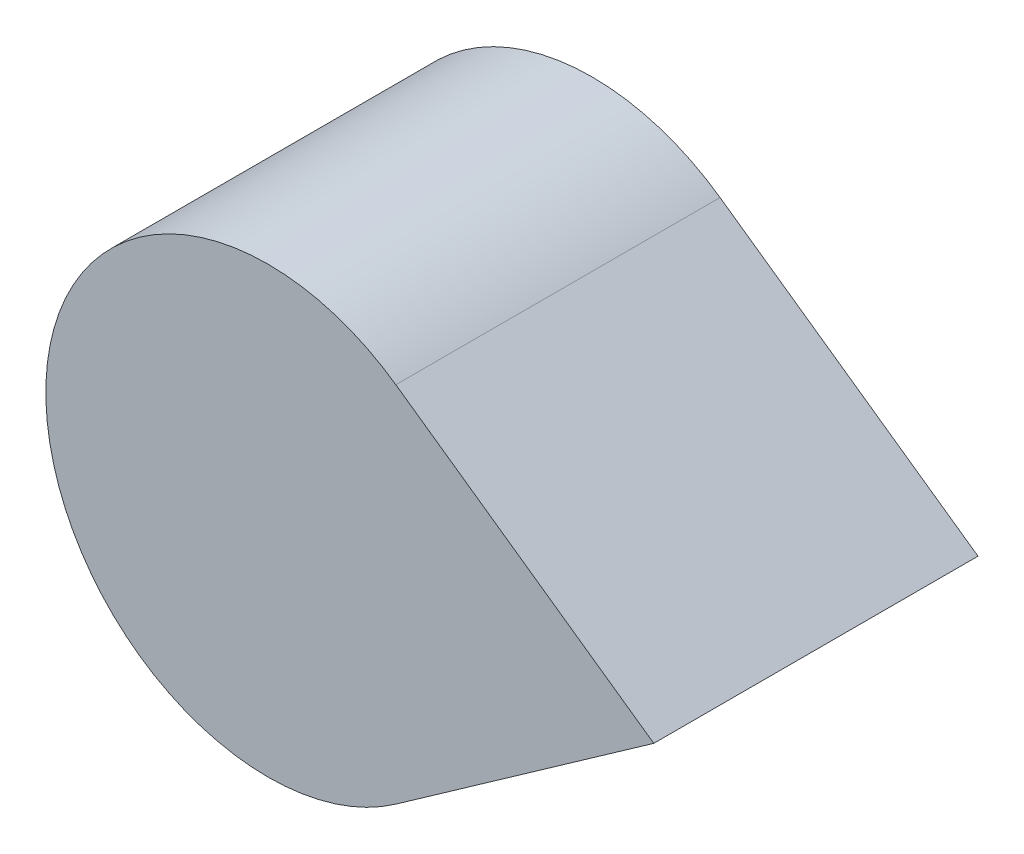
ISO-10303-21;
HEADER;
FILE_DESCRIPTION(('STEP AP214'),'2;1');
FILE_NAME('part.step','',(''),(''),'','','');
FILE_SCHEMA(('AUTOMOTIVE_DESIGN { 1 0 10303 214 1 1 1 1 }'));
ENDSEC;
DATA;
#1=APPLICATION_CONTEXT('core data for automotive mechanical design processes');
#2=APPLICATION_PROTOCOL_DEFINITION('international standard','automotive_design',2000,#1);
#3=PRODUCT_CONTEXT('',#1,'mechanical');
#4=PRODUCT('Part','Part','',(#3));
#5=PRODUCT_RELATED_PRODUCT_CATEGORY('part','',(#4));
#6=PRODUCT_DEFINITION_FORMATION('','',#4);
#7=PRODUCT_DEFINITION_CONTEXT('part definition',#1,'design');
#8=PRODUCT_DEFINITION('design','',#6,#7);
#9=PRODUCT_DEFINITION_SHAPE('','',#8);
#10=(LENGTH_UNIT() NAMED_UNIT(*) SI_UNIT(.MILLI.,.METRE.));
#11=(NAMED_UNIT(*) PLANE_ANGLE_UNIT() SI_UNIT($,.RADIAN.));
#12=(NAMED_UNIT(*) SI_UNIT($,.STERADIAN.) SOLID_ANGLE_UNIT());
#13=UNCERTAINTY_MEASURE_WITH_UNIT(LENGTH_MEASURE(1.E-05),#10,'distance_accuracy_value','');
#14=(GEOMETRIC_REPRESENTATION_CONTEXT(3) GLOBAL_UNCERTAINTY_ASSIGNED_CONTEXT((#13)) GLOBAL_UNIT_ASSIGNED_CONTEXT((#10,
#11,#12)) REPRESENTATION_CONTEXT('',''));
#15=CARTESIAN_POINT('',(0.,0.,0.));
#16=DIRECTION('',(0.,0.,1.));
#17=DIRECTION('',(1.,0.,0.));
#18=AXIS2_PLACEMENT_3D('',#15,#16,#17);
#19=CARTESIAN_POINT('',(9.83538469018549,13.9684785014052,-4.5));
#20=DIRECTION('',(-0.57571710587474,-0.817648955238868,0.));
#21=DIRECTION('',(0.817648955238869,-0.57571710587474,0.));
#22=AXIS2_PLACEMENT_3D('',#19,#20,#21);
#23=PLANE('',#22);
#24=DIRECTION('',(0.817648955238869,-0.57571710587474,0.));
#25=VECTOR('',#24,1.);
#26=CARTESIAN_POINT('',(9.83538469018549,13.9684785014052,0.));
#27=LINE('',#26,#25);
#28=CARTESIAN_POINT('',(21.9725157440518,5.42256901398586,0.));
#29=VERTEX_POINT('',#28);
#30=CARTESIAN_POINT('',(25.5527565653228,2.90167557830043,0.));
#31=VERTEX_POINT('',#30);
#32=EDGE_CURVE('E87',#29,#31,#27,.T.);
#33=ORIENTED_EDGE('',*,*,#32,.T.);
#34=DIRECTION('',(0.,0.,1.));
#35=VECTOR('',#34,1.);
#36=CARTESIAN_POINT('',(25.5527565653228,2.90167557830043,-4.5));
#37=LINE('',#36,#35);
#38=CARTESIAN_POINT('',(25.5527565653228,2.90167557830043,-4.5));
#39=VERTEX_POINT('',#38);
#40=EDGE_CURVE('E11',#39,#31,#37,.T.);
#41=ORIENTED_EDGE('',*,*,#40,.F.);
#42=DIRECTION('',(0.817648955238869,-0.57571710587474,0.));
#43=VECTOR('',#42,1.);
#44=CARTESIAN_POINT('',(9.83538469018549,13.9684785014052,-4.5));
#45=LINE('',#44,#43);
#46=CARTESIAN_POINT('',(21.9725157440518,5.42256901398586,-4.5));
#47=VERTEX_POINT('',#46);
#48=EDGE_CURVE('E80',#47,#39,#45,.T.);
#49=ORIENTED_EDGE('',*,*,#48,.F.);
#50=DIRECTION('',(0.,0.,1.));
#51=VECTOR('',#50,1.);
#52=CARTESIAN_POINT('',(21.9725157440518,5.42256901398586,-4.5));
#53=LINE('',#52,#51);
#54=EDGE_CURVE('E38',#47,#29,#53,.T.);
#55=ORIENTED_EDGE('',*,*,#54,.T.);
#56=EDGE_LOOP('',(#33,#41,#49,#55));
#57=FACE_BOUND('',#56,.T.);
#58=ADVANCED_FACE('F35',(#57),#23,.F.);
#59=CARTESIAN_POINT('',(7.10251739477166,-10.0881428823373,-4.5));
#60=DIRECTION('',(-0.575680622286033,0.81767464258369,0.));
#61=DIRECTION('',(-0.817674642583691,-0.575680622286033,0.));
#62=AXIS2_PLACEMENT_3D('',#59,#60,#61);
#63=PLANE('',#62);
#64=DIRECTION('',(-0.81767464258369,-0.575680622286033,0.));
#65=VECTOR('',#64,1.);
#66=CARTESIAN_POINT('',(7.10251739477166,-10.0881428823373,0.));
#67=LINE('',#66,#65);
#68=CARTESIAN_POINT('',(21.9724032668329,0.380941893364712,0.));
#69=VERTEX_POINT('',#68);
#70=EDGE_CURVE('E70',#31,#69,#67,.T.);
#71=ORIENTED_EDGE('',*,*,#70,.T.);
#72=DIRECTION('',(0.,0.,1.));
#73=VECTOR('',#72,1.);
#74=CARTESIAN_POINT('',(21.9724032668329,0.380941893364712,-4.5));
#75=LINE('',#74,#73);
#76=CARTESIAN_POINT('',(21.9724032668329,0.380941893364712,-4.5));
#77=VERTEX_POINT('',#76);
#78=EDGE_CURVE('E44',#77,#69,#75,.T.);
#79=ORIENTED_EDGE('',*,*,#78,.F.);
#80=DIRECTION('',(-0.81767464258369,-0.575680622286033,0.));
#81=VECTOR('',#80,1.);
#82=CARTESIAN_POINT('',(7.10251739477166,-10.0881428823373,-4.5));
#83=LINE('',#82,#81);
#84=EDGE_CURVE('E52',#39,#77,#83,.T.);
#85=ORIENTED_EDGE('',*,*,#84,.F.);
#86=ORIENTED_EDGE('',*,*,#40,.T.);
#87=EDGE_LOOP('',(#71,#79,#85,#86));
#88=FACE_BOUND('',#87,.T.);
#89=ADVANCED_FACE('F90',(#88),#63,.F.);
#90=CARTESIAN_POINT('',(20.1976064975587,2.90179505012411,-4.5));
#91=DIRECTION('',(0.,0.,1.));
#92=DIRECTION('',(1.,0.,0.));
#93=AXIS2_PLACEMENT_3D('',#90,#91,#92);
#94=CYLINDRICAL_SURFACE('',#93,3.08295381252621);
#95=CARTESIAN_POINT('',(20.1976064975587,2.90179505012411,0.));
#96=DIRECTION('',(0.,0.,1.));
#97=DIRECTION('',(1.,0.,0.));
#98=AXIS2_PLACEMENT_3D('',#95,#96,#97);
#99=CIRCLE('',#98,3.08295381252621);
#100=EDGE_CURVE('E76',#29,#69,#99,.T.);
#101=ORIENTED_EDGE('',*,*,#100,.F.);
#102=ORIENTED_EDGE('',*,*,#54,.F.);
#103=CARTESIAN_POINT('',(20.1976064975587,2.90179505012411,-4.5));
#104=DIRECTION('',(0.,0.,1.));
#105=DIRECTION('',(1.,0.,0.));
#106=AXIS2_PLACEMENT_3D('',#103,#104,#105);
#107=CIRCLE('',#106,3.08295381252621);
#108=EDGE_CURVE('E75',#47,#77,#107,.T.);
#109=ORIENTED_EDGE('',*,*,#108,.T.);
#110=ORIENTED_EDGE('',*,*,#78,.T.);
#111=EDGE_LOOP('',(#101,#102,#109,#110));
#112=FACE_BOUND('',#111,.T.);
#113=ADVANCED_FACE('F73',(#112),#94,.T.);
#114=CARTESIAN_POINT('',(0.,0.,-4.5));
#115=DIRECTION('',(0.,0.,1.));
#116=DIRECTION('',(1.,0.,0.));
#117=AXIS2_PLACEMENT_3D('',#114,#115,#116);
#118=PLANE('',#117);
#119=ORIENTED_EDGE('',*,*,#48,.T.);
#120=ORIENTED_EDGE('',*,*,#84,.T.);
#121=ORIENTED_EDGE('',*,*,#108,.F.);
#122=EDGE_LOOP('',(#119,#120,#121));
#123=FACE_BOUND('',#122,.T.);
#124=ADVANCED_FACE('F83',(#123),#118,.F.);
#125=CARTESIAN_POINT('',(0.,0.,0.));
#126=DIRECTION('',(0.,0.,1.));
#127=DIRECTION('',(1.,0.,0.));
#128=AXIS2_PLACEMENT_3D('',#125,#126,#127);
#129=PLANE('',#128);
#130=ORIENTED_EDGE('',*,*,#32,.F.);
#131=ORIENTED_EDGE('',*,*,#100,.T.);
#132=ORIENTED_EDGE('',*,*,#70,.F.);
#133=EDGE_LOOP('',(#130,#131,#132));
#134=FACE_BOUND('',#133,.T.);
#135=ADVANCED_FACE('F91',(#134),#129,.T.);
#136=CLOSED_SHELL('',(#58,#89,#113,#124,#135));
#137=MANIFOLD_SOLID_BREP('B2',#136);
#138=ADVANCED_BREP_SHAPE_REPRESENTATION('',(#18,#137),#14);
#139=SHAPE_DEFINITION_REPRESENTATION(#9,#138);
ENDSEC;
END-ISO-10303-21;
